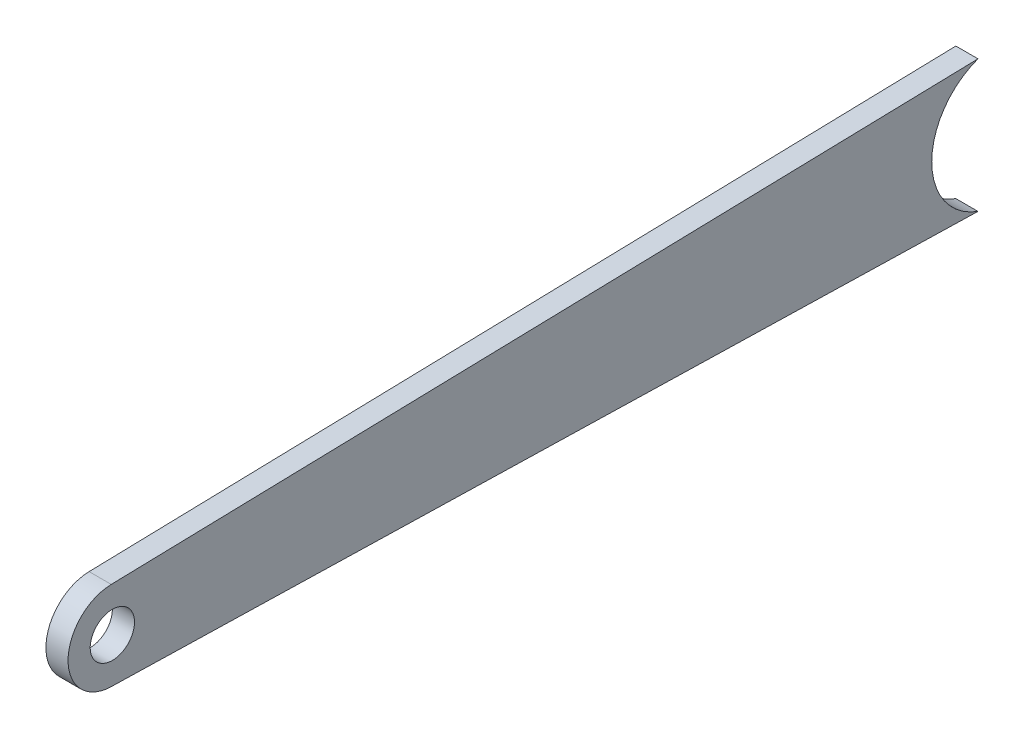
ISO-10303-21;
HEADER;
FILE_DESCRIPTION(('STEP AP214'),'2;1');
FILE_NAME('part.step','',(''),(''),'','','');
FILE_SCHEMA(('AUTOMOTIVE_DESIGN { 1 0 10303 214 1 1 1 1 }'));
ENDSEC;
DATA;
#1=APPLICATION_CONTEXT('core data for automotive mechanical design processes');
#2=APPLICATION_PROTOCOL_DEFINITION('international standard','automotive_design',2000,#1);
#3=PRODUCT_CONTEXT('',#1,'mechanical');
#4=PRODUCT('Part','Part','',(#3));
#5=PRODUCT_RELATED_PRODUCT_CATEGORY('part','',(#4));
#6=PRODUCT_DEFINITION_FORMATION('','',#4);
#7=PRODUCT_DEFINITION_CONTEXT('part definition',#1,'design');
#8=PRODUCT_DEFINITION('design','',#6,#7);
#9=PRODUCT_DEFINITION_SHAPE('','',#8);
#10=(LENGTH_UNIT() NAMED_UNIT(*) SI_UNIT(.MILLI.,.METRE.));
#11=(NAMED_UNIT(*) PLANE_ANGLE_UNIT() SI_UNIT($,.RADIAN.));
#12=(NAMED_UNIT(*) SI_UNIT($,.STERADIAN.) SOLID_ANGLE_UNIT());
#13=UNCERTAINTY_MEASURE_WITH_UNIT(LENGTH_MEASURE(1.E-05),#10,'distance_accuracy_value','');
#14=(GEOMETRIC_REPRESENTATION_CONTEXT(3) GLOBAL_UNCERTAINTY_ASSIGNED_CONTEXT((#13)) GLOBAL_UNIT_ASSIGNED_CONTEXT((#10,
#11,#12)) REPRESENTATION_CONTEXT('',''));
#15=CARTESIAN_POINT('',(0.,0.,0.));
#16=DIRECTION('',(0.,0.,1.));
#17=DIRECTION('',(1.,0.,0.));
#18=AXIS2_PLACEMENT_3D('',#15,#16,#17);
#19=CARTESIAN_POINT('',(2.5,15.0446342223517,0.378296109508558));
#20=DIRECTION('',(0.,0.999684016354854,0.0251369736568986));
#21=DIRECTION('',(0.,-0.0251369736568986,0.999684016354854));
#22=AXIS2_PLACEMENT_3D('',#19,#20,#21);
#23=PLANE('',#22);
#24=DIRECTION('',(0.,0.0251369736568986,-0.999684016354854));
#25=VECTOR('',#24,1.);
#26=CARTESIAN_POINT('',(-2.5,15.0446342223517,0.378296109508558));
#27=LINE('',#26,#25);
#28=CARTESIAN_POINT('',(-2.5,9.99684016354854,201.126369736569));
#29=VERTEX_POINT('',#28);
#30=CARTESIAN_POINT('',(-2.5,14.9176203549763,5.429569775295));
#31=VERTEX_POINT('',#30);
#32=EDGE_CURVE('E112',#29,#31,#27,.T.);
#33=ORIENTED_EDGE('',*,*,#32,.F.);
#34=DIRECTION('',(-1.,0.,0.));
#35=VECTOR('',#34,1.);
#36=CARTESIAN_POINT('',(2.5,9.99684016354854,201.126369736569));
#37=LINE('',#36,#35);
#38=CARTESIAN_POINT('',(2.5,9.99684016354854,201.126369736569));
#39=VERTEX_POINT('',#38);
#40=EDGE_CURVE('E11',#39,#29,#37,.T.);
#41=ORIENTED_EDGE('',*,*,#40,.F.);
#42=DIRECTION('',(0.,0.0251369736568986,-0.999684016354854));
#43=VECTOR('',#42,1.);
#44=CARTESIAN_POINT('',(2.5,15.0446342223517,0.378296109508558));
#45=LINE('',#44,#43);
#46=CARTESIAN_POINT('',(2.5,14.9176203549763,5.429569775295));
#47=VERTEX_POINT('',#46);
#48=EDGE_CURVE('E96',#39,#47,#45,.T.);
#49=ORIENTED_EDGE('',*,*,#48,.T.);
#50=DIRECTION('',(-1.,0.,0.));
#51=VECTOR('',#50,1.);
#52=CARTESIAN_POINT('',(2.5,14.9176203549763,5.429569775295));
#53=LINE('',#52,#51);
#54=EDGE_CURVE('E58',#47,#31,#53,.T.);
#55=ORIENTED_EDGE('',*,*,#54,.T.);
#56=EDGE_LOOP('',(#33,#41,#49,#55));
#57=FACE_BOUND('',#56,.T.);
#58=ADVANCED_FACE('F41',(#57),#23,.T.);
#59=CARTESIAN_POINT('',(2.5,0.,200.875));
#60=DIRECTION('',(-1.,0.,0.));
#61=DIRECTION('',(0.,0.,1.));
#62=AXIS2_PLACEMENT_3D('',#59,#60,#61);
#63=CYLINDRICAL_SURFACE('',#62,10.);
#64=CARTESIAN_POINT('',(-2.5,0.,200.875));
#65=DIRECTION('',(1.,0.,0.));
#66=DIRECTION('',(0.,0.,-1.));
#67=AXIS2_PLACEMENT_3D('',#64,#65,#66);
#68=CIRCLE('',#67,10.);
#69=CARTESIAN_POINT('',(-2.5,-9.99684016354854,201.126369736569));
#70=VERTEX_POINT('',#69);
#71=EDGE_CURVE('E101',#29,#70,#68,.T.);
#72=ORIENTED_EDGE('',*,*,#71,.T.);
#73=DIRECTION('',(-1.,0.,0.));
#74=VECTOR('',#73,1.);
#75=CARTESIAN_POINT('',(2.5,-9.99684016354854,201.126369736569));
#76=LINE('',#75,#74);
#77=CARTESIAN_POINT('',(2.5,-9.99684016354854,201.126369736569));
#78=VERTEX_POINT('',#77);
#79=EDGE_CURVE('E50',#78,#70,#76,.T.);
#80=ORIENTED_EDGE('',*,*,#79,.F.);
#81=CARTESIAN_POINT('',(2.5,0.,200.875));
#82=DIRECTION('',(1.,0.,0.));
#83=DIRECTION('',(0.,0.,-1.));
#84=AXIS2_PLACEMENT_3D('',#81,#82,#83);
#85=CIRCLE('',#84,10.);
#86=EDGE_CURVE('E92',#39,#78,#85,.T.);
#87=ORIENTED_EDGE('',*,*,#86,.F.);
#88=ORIENTED_EDGE('',*,*,#40,.T.);
#89=EDGE_LOOP('',(#72,#80,#87,#88));
#90=FACE_BOUND('',#89,.T.);
#91=ADVANCED_FACE('F99',(#90),#63,.T.);
#92=CARTESIAN_POINT('',(2.5,-15.0446342223517,0.378296109508558));
#93=DIRECTION('',(0.,0.999684016354854,-0.0251369736568986));
#94=DIRECTION('',(0.,0.0251369736568986,0.999684016354854));
#95=AXIS2_PLACEMENT_3D('',#92,#93,#94);
#96=PLANE('',#95);
#97=DIRECTION('',(0.,-0.0251369736568986,-0.999684016354854));
#98=VECTOR('',#97,1.);
#99=CARTESIAN_POINT('',(-2.5,-15.0446342223517,0.378296109508558));
#100=LINE('',#99,#98);
#101=CARTESIAN_POINT('',(-2.5,-14.9176203549763,5.429569775295));
#102=VERTEX_POINT('',#101);
#103=EDGE_CURVE('E109',#70,#102,#100,.T.);
#104=ORIENTED_EDGE('',*,*,#103,.T.);
#105=DIRECTION('',(-1.,0.,0.));
#106=VECTOR('',#105,1.);
#107=CARTESIAN_POINT('',(2.5,-14.9176203549763,5.429569775295));
#108=LINE('',#107,#106);
#109=CARTESIAN_POINT('',(2.5,-14.9176203549763,5.429569775295));
#110=VERTEX_POINT('',#109);
#111=EDGE_CURVE('E72',#110,#102,#108,.T.);
#112=ORIENTED_EDGE('',*,*,#111,.F.);
#113=DIRECTION('',(0.,-0.0251369736568986,-0.999684016354854));
#114=VECTOR('',#113,1.);
#115=CARTESIAN_POINT('',(2.5,-15.0446342223517,0.378296109508558));
#116=LINE('',#115,#114);
#117=EDGE_CURVE('E84',#78,#110,#116,.T.);
#118=ORIENTED_EDGE('',*,*,#117,.F.);
#119=ORIENTED_EDGE('',*,*,#79,.T.);
#120=EDGE_LOOP('',(#104,#112,#118,#119));
#121=FACE_BOUND('',#120,.T.);
#122=ADVANCED_FACE('F86',(#121),#96,.F.);
#123=CARTESIAN_POINT('',(2.5,0.,200.875));
#124=DIRECTION('',(-1.,0.,0.));
#125=DIRECTION('',(0.,0.,1.));
#126=AXIS2_PLACEMENT_3D('',#123,#124,#125);
#127=CYLINDRICAL_SURFACE('',#126,5.);
#128=CARTESIAN_POINT('',(2.5,0.,200.875));
#129=DIRECTION('',(1.,0.,0.));
#130=DIRECTION('',(0.,0.,-1.));
#131=AXIS2_PLACEMENT_3D('',#128,#129,#130);
#132=CIRCLE('',#131,5.);
#133=CARTESIAN_POINT('',(2.5,0.,195.875));
#134=VERTEX_POINT('',#133);
#135=EDGE_CURVE('E108',#134,#134,#132,.T.);
#136=ORIENTED_EDGE('',*,*,#135,.T.);
#137=EDGE_LOOP('',(#136));
#138=FACE_BOUND('',#137,.T.);
#139=CARTESIAN_POINT('',(-2.5,0.,200.875));
#140=DIRECTION('',(1.,0.,0.));
#141=DIRECTION('',(0.,0.,-1.));
#142=AXIS2_PLACEMENT_3D('',#139,#140,#141);
#143=CIRCLE('',#142,5.);
#144=CARTESIAN_POINT('',(-2.5,0.,195.875));
#145=VERTEX_POINT('',#144);
#146=EDGE_CURVE('E114',#145,#145,#143,.T.);
#147=ORIENTED_EDGE('',*,*,#146,.F.);
#148=EDGE_LOOP('',(#147));
#149=FACE_BOUND('',#148,.T.);
#150=ADVANCED_FACE('F43',(#138,#149),#127,.F.);
#151=CARTESIAN_POINT('',(2.5,0.,0.));
#152=DIRECTION('',(-1.,0.,0.));
#153=DIRECTION('',(0.,0.,1.));
#154=AXIS2_PLACEMENT_3D('',#151,#152,#153);
#155=CYLINDRICAL_SURFACE('',#154,15.875);
#156=CARTESIAN_POINT('',(-2.5,0.,0.));
#157=DIRECTION('',(1.,0.,0.));
#158=DIRECTION('',(0.,0.,-1.));
#159=AXIS2_PLACEMENT_3D('',#156,#157,#158);
#160=CIRCLE('',#159,15.875);
#161=EDGE_CURVE('E105',#31,#102,#160,.T.);
#162=ORIENTED_EDGE('',*,*,#161,.F.);
#163=ORIENTED_EDGE('',*,*,#54,.F.);
#164=CARTESIAN_POINT('',(2.5,0.,0.));
#165=DIRECTION('',(1.,0.,0.));
#166=DIRECTION('',(0.,0.,-1.));
#167=AXIS2_PLACEMENT_3D('',#164,#165,#166);
#168=CIRCLE('',#167,15.875);
#169=EDGE_CURVE('E91',#47,#110,#168,.T.);
#170=ORIENTED_EDGE('',*,*,#169,.T.);
#171=ORIENTED_EDGE('',*,*,#111,.T.);
#172=EDGE_LOOP('',(#162,#163,#170,#171));
#173=FACE_BOUND('',#172,.T.);
#174=ADVANCED_FACE('F126',(#173),#155,.F.);
#175=CARTESIAN_POINT('',(2.5,0.,0.));
#176=DIRECTION('',(1.,0.,0.));
#177=DIRECTION('',(0.,0.,-1.));
#178=AXIS2_PLACEMENT_3D('',#175,#176,#177);
#179=PLANE('',#178);
#180=ORIENTED_EDGE('',*,*,#135,.F.);
#181=EDGE_LOOP('',(#180));
#182=FACE_BOUND('',#181,.T.);
#183=ORIENTED_EDGE('',*,*,#48,.F.);
#184=ORIENTED_EDGE('',*,*,#86,.T.);
#185=ORIENTED_EDGE('',*,*,#117,.T.);
#186=ORIENTED_EDGE('',*,*,#169,.F.);
#187=EDGE_LOOP('',(#183,#184,#185,#186));
#188=FACE_BOUND('',#187,.T.);
#189=ADVANCED_FACE('F95',(#182,#188),#179,.T.);
#190=CARTESIAN_POINT('',(-2.5,0.,0.));
#191=DIRECTION('',(1.,0.,0.));
#192=DIRECTION('',(0.,0.,-1.));
#193=AXIS2_PLACEMENT_3D('',#190,#191,#192);
#194=PLANE('',#193);
#195=ORIENTED_EDGE('',*,*,#146,.T.);
#196=EDGE_LOOP('',(#195));
#197=FACE_BOUND('',#196,.T.);
#198=ORIENTED_EDGE('',*,*,#32,.T.);
#199=ORIENTED_EDGE('',*,*,#161,.T.);
#200=ORIENTED_EDGE('',*,*,#103,.F.);
#201=ORIENTED_EDGE('',*,*,#71,.F.);
#202=EDGE_LOOP('',(#198,#199,#200,#201));
#203=FACE_BOUND('',#202,.T.);
#204=ADVANCED_FACE('F125',(#197,#203),#194,.F.);
#205=CLOSED_SHELL('',(#58,#91,#122,#150,#174,#189,#204));
#206=MANIFOLD_SOLID_BREP('B2',#205);
#207=ADVANCED_BREP_SHAPE_REPRESENTATION('',(#18,#206),#14);
#208=SHAPE_DEFINITION_REPRESENTATION(#9,#207);
ENDSEC;
END-ISO-10303-21;
